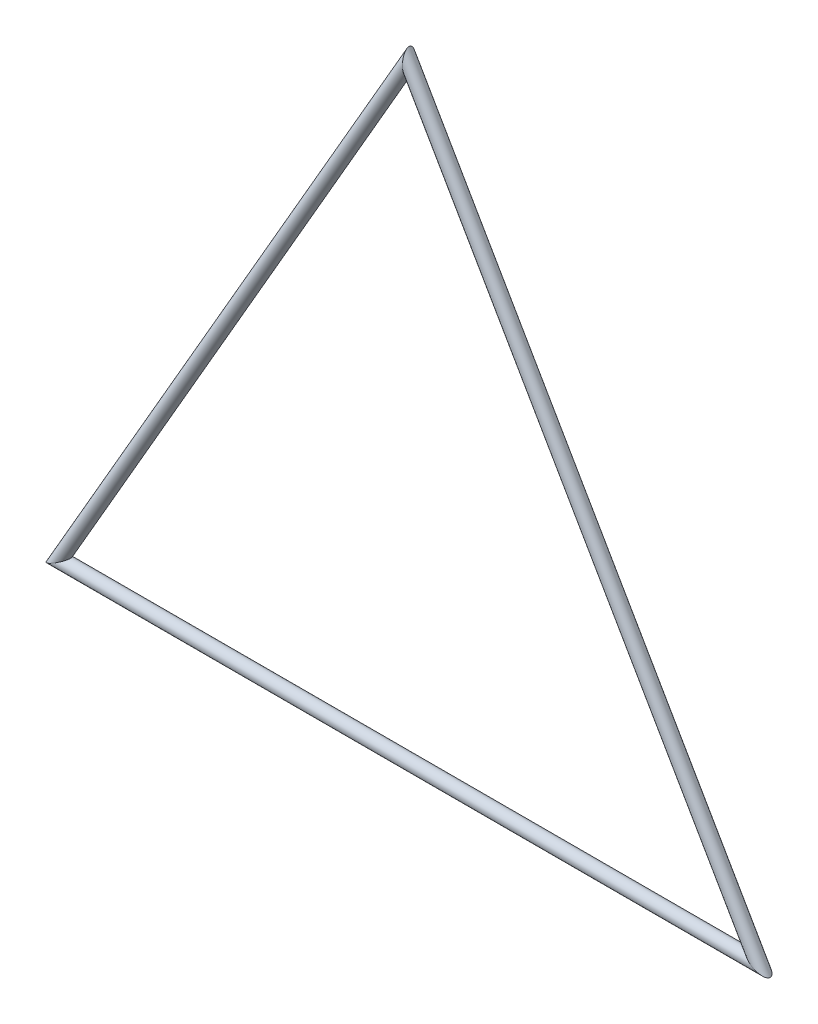
ISO-10303-21;
HEADER;
FILE_DESCRIPTION(('STEP AP214'),'2;1');
FILE_NAME('part.step','',(''),(''),'','','');
FILE_SCHEMA(('AUTOMOTIVE_DESIGN { 1 0 10303 214 1 1 1 1 }'));
ENDSEC;
DATA;
#1=APPLICATION_CONTEXT('core data for automotive mechanical design processes');
#2=APPLICATION_PROTOCOL_DEFINITION('international standard','automotive_design',2000,#1);
#3=PRODUCT_CONTEXT('',#1,'mechanical');
#4=PRODUCT('Part','Part','',(#3));
#5=PRODUCT_RELATED_PRODUCT_CATEGORY('part','',(#4));
#6=PRODUCT_DEFINITION_FORMATION('','',#4);
#7=PRODUCT_DEFINITION_CONTEXT('part definition',#1,'design');
#8=PRODUCT_DEFINITION('design','',#6,#7);
#9=PRODUCT_DEFINITION_SHAPE('','',#8);
#10=(LENGTH_UNIT() NAMED_UNIT(*) SI_UNIT(.MILLI.,.METRE.));
#11=(NAMED_UNIT(*) PLANE_ANGLE_UNIT() SI_UNIT($,.RADIAN.));
#12=(NAMED_UNIT(*) SI_UNIT($,.STERADIAN.) SOLID_ANGLE_UNIT());
#13=UNCERTAINTY_MEASURE_WITH_UNIT(LENGTH_MEASURE(1.E-05),#10,'distance_accuracy_value','');
#14=(GEOMETRIC_REPRESENTATION_CONTEXT(3) GLOBAL_UNCERTAINTY_ASSIGNED_CONTEXT((#13)) GLOBAL_UNIT_ASSIGNED_CONTEXT((#10,
#11,#12)) REPRESENTATION_CONTEXT('',''));
#15=CARTESIAN_POINT('',(0.,0.,0.));
#16=DIRECTION('',(0.,0.,1.));
#17=DIRECTION('',(1.,0.,0.));
#18=AXIS2_PLACEMENT_3D('',#15,#16,#17);
#19=CARTESIAN_POINT('',(0.,0.,0.));
#20=DIRECTION('',(0.499999999999998,0.86602540378444,0.));
#21=DIRECTION('',(-0.86602540378444,0.499999999999998,0.));
#22=AXIS2_PLACEMENT_3D('',#19,#20,#21);
#23=CYLINDRICAL_SURFACE('',#22,14.32941);
#24=CARTESIAN_POINT('',(0.,0.,0.));
#25=DIRECTION('',(0.500000000000001,-0.866025403784438,0.));
#26=DIRECTION('',(0.866025403784438,0.500000000000001,0.));
#27=AXIS2_PLACEMENT_3D('',#24,#25,#26);
#28=ELLIPSE('',#27,28.6588199999999,14.32941);
#29=CARTESIAN_POINT('',(24.8192661624855,14.32941,0.));
#30=VERTEX_POINT('',#29);
#31=EDGE_CURVE('E60',#30,#30,#28,.T.);
#32=ORIENTED_EDGE('',*,*,#31,.F.);
#33=EDGE_LOOP('',(#32));
#34=FACE_BOUND('',#33,.T.);
#35=CARTESIAN_POINT('',(761.999999999993,1319.82271536748,0.));
#36=DIRECTION('',(1.,0.,0.));
#37=DIRECTION('',(0.,1.,0.));
#38=AXIS2_PLACEMENT_3D('',#35,#36,#37);
#39=ELLIPSE('',#38,28.6588199999999,14.32941);
#40=CARTESIAN_POINT('',(761.999999999993,1348.48153536748,0.));
#41=VERTEX_POINT('',#40);
#42=EDGE_CURVE('E12',#41,#41,#39,.T.);
#43=ORIENTED_EDGE('',*,*,#42,.F.);
#44=EDGE_LOOP('',(#43));
#45=FACE_BOUND('',#44,.T.);
#46=ADVANCED_FACE('F53',(#34,#45),#23,.T.);
#47=CARTESIAN_POINT('',(0.,0.,0.));
#48=DIRECTION('',(0.500000000000001,-0.866025403784438,0.));
#49=DIRECTION('',(0.866025403784438,0.500000000000001,0.));
#50=AXIS2_PLACEMENT_3D('',#47,#48,#49);
#51=PLANE('',#50);
#52=ORIENTED_EDGE('',*,*,#31,.T.);
#53=EDGE_LOOP('',(#52));
#54=FACE_BOUND('',#53,.T.);
#55=ADVANCED_FACE('F66',(#54),#51,.T.);
#56=CARTESIAN_POINT('',(761.999999999993,1319.82271536748,0.));
#57=DIRECTION('',(1.,0.,0.));
#58=DIRECTION('',(0.,1.,0.));
#59=AXIS2_PLACEMENT_3D('',#56,#57,#58);
#60=PLANE('',#59);
#61=ORIENTED_EDGE('',*,*,#42,.T.);
#62=EDGE_LOOP('',(#61));
#63=FACE_BOUND('',#62,.T.);
#64=ADVANCED_FACE('F55',(#63),#60,.T.);
#65=CLOSED_SHELL('',(#46,#55,#64));
#66=MANIFOLD_SOLID_BREP('B2',#65);
#67=CARTESIAN_POINT('',(761.999999999993,1319.82271536748,0.));
#68=DIRECTION('',(0.500000000000004,-0.866025403784436,0.));
#69=DIRECTION('',(0.866025403784436,0.500000000000004,0.));
#70=AXIS2_PLACEMENT_3D('',#67,#68,#69);
#71=CYLINDRICAL_SURFACE('',#70,14.32941);
#72=CARTESIAN_POINT('',(1524.,4.44089209850063E-13,0.));
#73=DIRECTION('',(-0.499999999999998,-0.86602540378444,0.));
#74=DIRECTION('',(0.86602540378444,-0.499999999999998,0.));
#75=AXIS2_PLACEMENT_3D('',#72,#73,#74);
#76=ELLIPSE('',#75,28.6588200000001,14.32941);
#77=CARTESIAN_POINT('',(1548.81926616249,-14.3294099999995,0.));
#78=VERTEX_POINT('',#77);
#79=EDGE_CURVE('E133',#78,#78,#76,.T.);
#80=ORIENTED_EDGE('',*,*,#79,.F.);
#81=EDGE_LOOP('',(#80));
#82=FACE_BOUND('',#81,.T.);
#83=CARTESIAN_POINT('',(761.999999999993,1319.82271536748,0.));
#84=DIRECTION('',(-1.,0.,0.));
#85=DIRECTION('',(0.,-1.,0.));
#86=AXIS2_PLACEMENT_3D('',#83,#84,#85);
#87=ELLIPSE('',#86,28.6588199999999,14.32941);
#88=CARTESIAN_POINT('',(761.999999999994,1291.16389536748,0.));
#89=VERTEX_POINT('',#88);
#90=EDGE_CURVE('E52',#89,#89,#87,.T.);
#91=ORIENTED_EDGE('',*,*,#90,.F.);
#92=EDGE_LOOP('',(#91));
#93=FACE_BOUND('',#92,.T.);
#94=ADVANCED_FACE('F126',(#82,#93),#71,.T.);
#95=CARTESIAN_POINT('',(1524.,0.,0.));
#96=DIRECTION('',(-0.499999999999998,-0.86602540378444,0.));
#97=DIRECTION('',(0.86602540378444,-0.499999999999998,0.));
#98=AXIS2_PLACEMENT_3D('',#95,#96,#97);
#99=PLANE('',#98);
#100=ORIENTED_EDGE('',*,*,#79,.T.);
#101=EDGE_LOOP('',(#100));
#102=FACE_BOUND('',#101,.T.);
#103=ADVANCED_FACE('F139',(#102),#99,.T.);
#104=CARTESIAN_POINT('',(761.999999999993,1319.82271536748,0.));
#105=DIRECTION('',(-1.,0.,0.));
#106=DIRECTION('',(0.,-1.,0.));
#107=AXIS2_PLACEMENT_3D('',#104,#105,#106);
#108=PLANE('',#107);
#109=ORIENTED_EDGE('',*,*,#90,.T.);
#110=EDGE_LOOP('',(#109));
#111=FACE_BOUND('',#110,.T.);
#112=ADVANCED_FACE('F128',(#111),#108,.T.);
#113=CLOSED_SHELL('',(#94,#103,#112));
#114=MANIFOLD_SOLID_BREP('B7',#113);
#115=CARTESIAN_POINT('',(1524.,0.,0.));
#116=DIRECTION('',(-1.,0.,0.));
#117=DIRECTION('',(0.,0.,1.));
#118=AXIS2_PLACEMENT_3D('',#115,#116,#117);
#119=CYLINDRICAL_SURFACE('',#118,14.32941);
#120=CARTESIAN_POINT('',(1524.,0.,0.));
#121=DIRECTION('',(0.499999999999998,0.86602540378444,0.));
#122=DIRECTION('',(-0.86602540378444,0.499999999999998,0.));
#123=AXIS2_PLACEMENT_3D('',#120,#121,#122);
#124=ELLIPSE('',#123,28.6588200000001,14.32941);
#125=CARTESIAN_POINT('',(1499.18073383751,14.32941,0.));
#126=VERTEX_POINT('',#125);
#127=EDGE_CURVE('E199',#126,#126,#124,.T.);
#128=ORIENTED_EDGE('',*,*,#127,.F.);
#129=EDGE_LOOP('',(#128));
#130=FACE_BOUND('',#129,.T.);
#131=CARTESIAN_POINT('',(0.,0.,0.));
#132=DIRECTION('',(-0.500000000000001,0.866025403784438,0.));
#133=DIRECTION('',(-0.866025403784438,-0.500000000000001,0.));
#134=AXIS2_PLACEMENT_3D('',#131,#132,#133);
#135=ELLIPSE('',#134,28.6588199999999,14.32941);
#136=CARTESIAN_POINT('',(-24.8192661624855,-14.32941,0.));
#137=VERTEX_POINT('',#136);
#138=EDGE_CURVE('E125',#137,#137,#135,.T.);
#139=ORIENTED_EDGE('',*,*,#138,.F.);
#140=EDGE_LOOP('',(#139));
#141=FACE_BOUND('',#140,.T.);
#142=ADVANCED_FACE('F192',(#130,#141),#119,.T.);
#143=CARTESIAN_POINT('',(1524.,0.,0.));
#144=DIRECTION('',(0.499999999999998,0.86602540378444,0.));
#145=DIRECTION('',(-0.86602540378444,0.499999999999998,0.));
#146=AXIS2_PLACEMENT_3D('',#143,#144,#145);
#147=PLANE('',#146);
#148=ORIENTED_EDGE('',*,*,#127,.T.);
#149=EDGE_LOOP('',(#148));
#150=FACE_BOUND('',#149,.T.);
#151=ADVANCED_FACE('F205',(#150),#147,.T.);
#152=CARTESIAN_POINT('',(0.,0.,0.));
#153=DIRECTION('',(-0.500000000000001,0.866025403784438,0.));
#154=DIRECTION('',(-0.866025403784438,-0.500000000000001,0.));
#155=AXIS2_PLACEMENT_3D('',#152,#153,#154);
#156=PLANE('',#155);
#157=ORIENTED_EDGE('',*,*,#138,.T.);
#158=EDGE_LOOP('',(#157));
#159=FACE_BOUND('',#158,.T.);
#160=ADVANCED_FACE('F194',(#159),#156,.T.);
#161=CLOSED_SHELL('',(#142,#151,#160));
#162=MANIFOLD_SOLID_BREP('B47',#161);
#163=ADVANCED_BREP_SHAPE_REPRESENTATION('',(#18,#66,#114,#162),#14);
#164=SHAPE_DEFINITION_REPRESENTATION(#9,#163);
ENDSEC;
END-ISO-10303-21;
